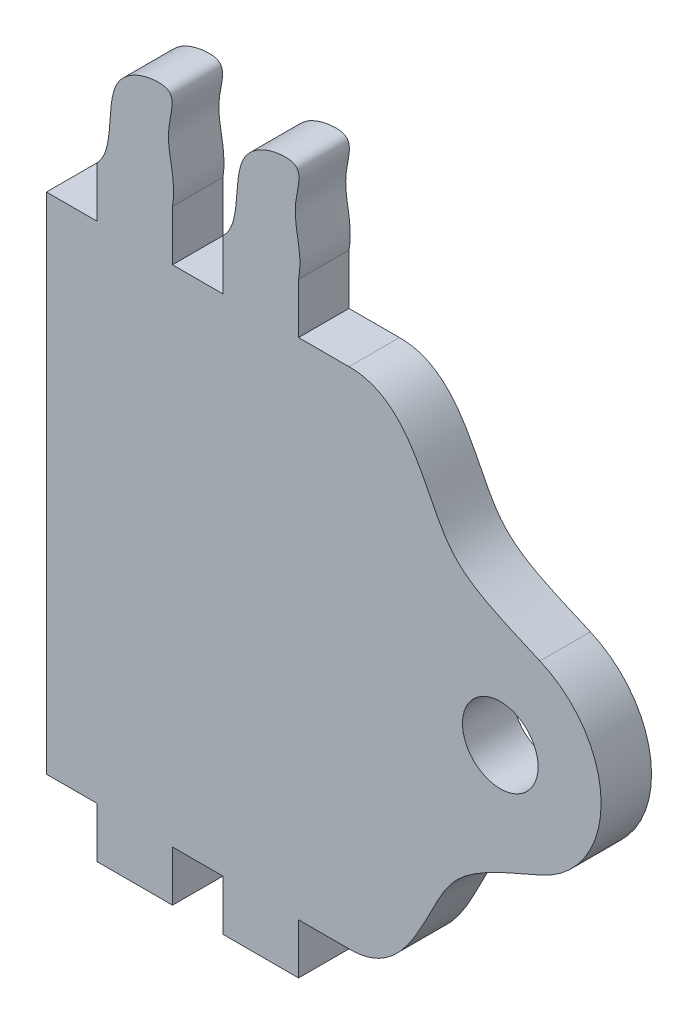
ISO-10303-21;
HEADER;
FILE_DESCRIPTION(('STEP AP214'),'2;1');
FILE_NAME('part.step','',(''),(''),'','','');
FILE_SCHEMA(('AUTOMOTIVE_DESIGN { 1 0 10303 214 1 1 1 1 }'));
ENDSEC;
DATA;
#1=APPLICATION_CONTEXT('core data for automotive mechanical design processes');
#2=APPLICATION_PROTOCOL_DEFINITION('international standard','automotive_design',2000,#1);
#3=PRODUCT_CONTEXT('',#1,'mechanical');
#4=PRODUCT('Part','Part','',(#3));
#5=PRODUCT_RELATED_PRODUCT_CATEGORY('part','',(#4));
#6=PRODUCT_DEFINITION_FORMATION('','',#4);
#7=PRODUCT_DEFINITION_CONTEXT('part definition',#1,'design');
#8=PRODUCT_DEFINITION('design','',#6,#7);
#9=PRODUCT_DEFINITION_SHAPE('','',#8);
#10=(LENGTH_UNIT() NAMED_UNIT(*) SI_UNIT(.MILLI.,.METRE.));
#11=(NAMED_UNIT(*) PLANE_ANGLE_UNIT() SI_UNIT($,.RADIAN.));
#12=(NAMED_UNIT(*) SI_UNIT($,.STERADIAN.) SOLID_ANGLE_UNIT());
#13=UNCERTAINTY_MEASURE_WITH_UNIT(LENGTH_MEASURE(1.E-05),#10,'distance_accuracy_value','');
#14=(GEOMETRIC_REPRESENTATION_CONTEXT(3) GLOBAL_UNCERTAINTY_ASSIGNED_CONTEXT((#13)) GLOBAL_UNIT_ASSIGNED_CONTEXT((#10,
#11,#12)) REPRESENTATION_CONTEXT('',''));
#15=CARTESIAN_POINT('',(0.,0.,0.));
#16=DIRECTION('',(0.,0.,1.));
#17=DIRECTION('',(1.,0.,0.));
#18=AXIS2_PLACEMENT_3D('',#15,#16,#17);
#19=CARTESIAN_POINT('',(1.5875,19.05,3.175));
#20=CARTESIAN_POINT('',(2.87606069652057,20.2829772560216,3.175));
#21=CARTESIAN_POINT('',(1.75087616831117,23.7170103339782,3.175));
#22=CARTESIAN_POINT('',(4.48010535425709,25.3439433085735,3.175));
#23=CARTESIAN_POINT('',(6.71396979884259,25.323271855298,3.175));
#24=CARTESIAN_POINT('',(5.66462971551239,22.0755663258377,3.175));
#25=CARTESIAN_POINT('',(6.66156491028358,20.8587639296577,3.175));
#26=CARTESIAN_POINT('',(6.35,19.05,3.175));
#27=B_SPLINE_CURVE_WITH_KNOTS('',3,(#19,#20,#21,#22,#23,#24,#25,#26),.UNSPECIFIED.,.F.,.F.,(4,1,
1,1,1,4),(0.,0.347503901702422,0.512635707363676,0.589513020634842,0.712232461777551,1.),.UNSPECIFIED.);
#28=DIRECTION('',(0.,0.,-1.));
#29=VECTOR('',#28,1.);
#30=SURFACE_OF_LINEAR_EXTRUSION('',#27,#29);
#31=CARTESIAN_POINT('',(1.5875,19.05,0.));
#32=CARTESIAN_POINT('',(2.87606069652057,20.2829772560216,0.));
#33=CARTESIAN_POINT('',(1.75087616831117,23.7170103339782,0.));
#34=CARTESIAN_POINT('',(4.48010535425709,25.3439433085735,0.));
#35=CARTESIAN_POINT('',(6.71396979884259,25.323271855298,0.));
#36=CARTESIAN_POINT('',(5.66462971551239,22.0755663258377,0.));
#37=CARTESIAN_POINT('',(6.66156491028358,20.8587639296577,0.));
#38=CARTESIAN_POINT('',(6.35,19.05,0.));
#39=B_SPLINE_CURVE_WITH_KNOTS('',3,(#31,#32,#33,#34,#35,#36,#37,#38),.UNSPECIFIED.,.F.,.F.,(4,1,
1,1,1,4),(0.,0.347503901702422,0.512635707363676,0.589513020634842,0.712232461777551,1.),.UNSPECIFIED.);
#40=CARTESIAN_POINT('',(1.5875,19.05,0.));
#41=VERTEX_POINT('',#40);
#42=CARTESIAN_POINT('',(6.35,19.05,0.));
#43=VERTEX_POINT('',#42);
#44=EDGE_CURVE('E355',#41,#43,#39,.T.);
#45=ORIENTED_EDGE('',*,*,#44,.F.);
#46=DIRECTION('',(0.,0.,-1.));
#47=VECTOR('',#46,1.);
#48=CARTESIAN_POINT('',(1.5875,19.05,3.175));
#49=LINE('',#48,#47);
#50=CARTESIAN_POINT('',(1.5875,19.05,3.175));
#51=VERTEX_POINT('',#50);
#52=EDGE_CURVE('E12',#51,#41,#49,.T.);
#53=ORIENTED_EDGE('',*,*,#52,.F.);
#54=CARTESIAN_POINT('',(6.35,19.05,3.175));
#55=VERTEX_POINT('',#54);
#56=EDGE_CURVE('E363',#51,#55,#27,.T.);
#57=ORIENTED_EDGE('',*,*,#56,.T.);
#58=DIRECTION('',(0.,0.,-1.));
#59=VECTOR('',#58,1.);
#60=CARTESIAN_POINT('',(6.35,19.05,3.175));
#61=LINE('',#60,#59);
#62=EDGE_CURVE('E206',#55,#43,#61,.T.);
#63=ORIENTED_EDGE('',*,*,#62,.T.);
#64=EDGE_LOOP('',(#45,#53,#57,#63));
#65=FACE_BOUND('',#64,.T.);
#66=ADVANCED_FACE('F196',(#65),#30,.T.);
#67=CARTESIAN_POINT('',(0.,0.,3.175));
#68=DIRECTION('',(0.,0.,1.));
#69=DIRECTION('',(1.,0.,0.));
#70=AXIS2_PLACEMENT_3D('',#67,#68,#69);
#71=PLANE('',#70);
#72=ORIENTED_EDGE('',*,*,#56,.F.);
#73=DIRECTION('',(0.,1.,0.));
#74=VECTOR('',#73,1.);
#75=CARTESIAN_POINT('',(1.5875,15.875,3.175));
#76=LINE('',#75,#74);
#77=CARTESIAN_POINT('',(1.5875,15.875,3.175));
#78=VERTEX_POINT('',#77);
#79=EDGE_CURVE('E349',#78,#51,#76,.T.);
#80=ORIENTED_EDGE('',*,*,#79,.F.);
#81=DIRECTION('',(-1.,0.,0.));
#82=VECTOR('',#81,1.);
#83=CARTESIAN_POINT('',(0.,15.875,3.175));
#84=LINE('',#83,#82);
#85=CARTESIAN_POINT('',(-1.5875,15.875,3.175));
#86=VERTEX_POINT('',#85);
#87=EDGE_CURVE('E360',#78,#86,#84,.T.);
#88=ORIENTED_EDGE('',*,*,#87,.T.);
#89=DIRECTION('',(0.,1.,0.));
#90=VECTOR('',#89,1.);
#91=CARTESIAN_POINT('',(-1.5875,0.,3.175));
#92=LINE('',#91,#90);
#93=CARTESIAN_POINT('',(-1.5875,19.05,3.175));
#94=VERTEX_POINT('',#93);
#95=EDGE_CURVE('E376',#86,#94,#92,.T.);
#96=ORIENTED_EDGE('',*,*,#95,.T.);
#97=CARTESIAN_POINT('',(-6.35,19.05,3.175));
#98=CARTESIAN_POINT('',(-5.10894803273728,20.3128381420379,3.175));
#99=CARTESIAN_POINT('',(-6.2487975668104,23.7826275370671,3.175));
#100=CARTESIAN_POINT('',(-3.5046682451137,25.4227491748254,3.175));
#101=CARTESIAN_POINT('',(-1.27059543399362,25.4018504855543,3.175));
#102=CARTESIAN_POINT('',(-2.33046195009797,22.1181936868102,3.175));
#103=CARTESIAN_POINT('',(-1.30296019047837,20.9022932957206,3.175));
#104=CARTESIAN_POINT('',(-1.5875,19.05,3.175));
#105=B_SPLINE_CURVE_WITH_KNOTS('',3,(#97,#98,#99,#100,#101,#102,#103,#104),.UNSPECIFIED.,.F.,
.F.,(4,1,1,1,1,4),(0.,0.348300856335532,0.511853830627675,0.587996117031789,0.709542233008579,
1.),.UNSPECIFIED.);
#106=CARTESIAN_POINT('',(-6.35,19.05,3.175));
#107=VERTEX_POINT('',#106);
#108=EDGE_CURVE('E390',#107,#94,#105,.T.);
#109=ORIENTED_EDGE('',*,*,#108,.F.);
#110=DIRECTION('',(0.,1.,0.));
#111=VECTOR('',#110,1.);
#112=CARTESIAN_POINT('',(-6.35,0.,3.175));
#113=LINE('',#112,#111);
#114=CARTESIAN_POINT('',(-6.35,15.875,3.175));
#115=VERTEX_POINT('',#114);
#116=EDGE_CURVE('E381',#115,#107,#113,.T.);
#117=ORIENTED_EDGE('',*,*,#116,.F.);
#118=CARTESIAN_POINT('',(-9.525,15.875,3.175));
#119=VERTEX_POINT('',#118);
#120=EDGE_CURVE('E374',#115,#119,#84,.T.);
#121=ORIENTED_EDGE('',*,*,#120,.T.);
#122=DIRECTION('',(0.,1.,0.));
#123=VECTOR('',#122,1.);
#124=CARTESIAN_POINT('',(-9.525,0.,3.175));
#125=LINE('',#124,#123);
#126=CARTESIAN_POINT('',(-9.525,-15.875,3.175));
#127=VERTEX_POINT('',#126);
#128=EDGE_CURVE('E461',#127,#119,#125,.T.);
#129=ORIENTED_EDGE('',*,*,#128,.F.);
#130=DIRECTION('',(-1.,0.,0.));
#131=VECTOR('',#130,1.);
#132=CARTESIAN_POINT('',(0.,-15.875,3.175));
#133=LINE('',#132,#131);
#134=CARTESIAN_POINT('',(-6.34999999999999,-15.875,3.175));
#135=VERTEX_POINT('',#134);
#136=EDGE_CURVE('E523',#135,#127,#133,.T.);
#137=ORIENTED_EDGE('',*,*,#136,.F.);
#138=DIRECTION('',(0.,-1.,0.));
#139=VECTOR('',#138,1.);
#140=CARTESIAN_POINT('',(-6.35,0.,3.175));
#141=LINE('',#140,#139);
#142=CARTESIAN_POINT('',(-6.34999999999999,-19.05,3.175));
#143=VERTEX_POINT('',#142);
#144=EDGE_CURVE('E526',#135,#143,#141,.T.);
#145=ORIENTED_EDGE('',*,*,#144,.T.);
#146=DIRECTION('',(1.,0.,0.));
#147=VECTOR('',#146,1.);
#148=CARTESIAN_POINT('',(0.,-19.05,3.175));
#149=LINE('',#148,#147);
#150=CARTESIAN_POINT('',(-1.58749999999999,-19.05,3.175));
#151=VERTEX_POINT('',#150);
#152=EDGE_CURVE('E530',#143,#151,#149,.T.);
#153=ORIENTED_EDGE('',*,*,#152,.T.);
#154=DIRECTION('',(0.,-1.,0.));
#155=VECTOR('',#154,1.);
#156=CARTESIAN_POINT('',(-1.5875,0.,3.175));
#157=LINE('',#156,#155);
#158=CARTESIAN_POINT('',(-1.58749999999999,-15.875,3.175));
#159=VERTEX_POINT('',#158);
#160=EDGE_CURVE('E532',#159,#151,#157,.T.);
#161=ORIENTED_EDGE('',*,*,#160,.F.);
#162=CARTESIAN_POINT('',(1.58750000000001,-15.875,3.175));
#163=VERTEX_POINT('',#162);
#164=EDGE_CURVE('E528',#163,#159,#133,.T.);
#165=ORIENTED_EDGE('',*,*,#164,.F.);
#166=DIRECTION('',(0.,-1.,0.));
#167=VECTOR('',#166,1.);
#168=CARTESIAN_POINT('',(1.5875,0.,3.175));
#169=LINE('',#168,#167);
#170=CARTESIAN_POINT('',(1.58750000000001,-19.05,3.175));
#171=VERTEX_POINT('',#170);
#172=EDGE_CURVE('E535',#163,#171,#169,.T.);
#173=ORIENTED_EDGE('',*,*,#172,.T.);
#174=DIRECTION('',(1.,0.,0.));
#175=VECTOR('',#174,1.);
#176=CARTESIAN_POINT('',(0.,-19.05,3.175));
#177=LINE('',#176,#175);
#178=CARTESIAN_POINT('',(6.35000000000001,-19.05,3.175));
#179=VERTEX_POINT('',#178);
#180=EDGE_CURVE('E537',#171,#179,#177,.T.);
#181=ORIENTED_EDGE('',*,*,#180,.T.);
#182=DIRECTION('',(0.,-1.,0.));
#183=VECTOR('',#182,1.);
#184=CARTESIAN_POINT('',(6.35,0.,3.175));
#185=LINE('',#184,#183);
#186=CARTESIAN_POINT('',(6.35000000000001,-15.875,3.175));
#187=VERTEX_POINT('',#186);
#188=EDGE_CURVE('E539',#187,#179,#185,.T.);
#189=ORIENTED_EDGE('',*,*,#188,.F.);
#190=CARTESIAN_POINT('',(9.525,-15.875,3.175));
#191=VERTEX_POINT('',#190);
#192=EDGE_CURVE('E527',#191,#187,#133,.T.);
#193=ORIENTED_EDGE('',*,*,#192,.F.);
#194=CARTESIAN_POINT('',(21.5475943035882,-5.83819515729678,3.175));
#195=CARTESIAN_POINT('',(17.7413983110655,-7.46649520091281,3.175));
#196=CARTESIAN_POINT('',(15.0309393036737,-8.83650062794347,3.175));
#197=CARTESIAN_POINT('',(13.0092812161382,-15.9170915840705,3.175));
#198=CARTESIAN_POINT('',(9.525,-15.875,3.175));
#199=B_SPLINE_CURVE_WITH_KNOTS('',3,(#194,#195,#196,#197,#198),.UNSPECIFIED.,.F.,.F.,(4,1,4),
(0.,0.458191309021658,1.),.UNSPECIFIED.);
#200=CARTESIAN_POINT('',(21.5475943035882,-5.83819515729678,3.175));
#201=VERTEX_POINT('',#200);
#202=EDGE_CURVE('E542',#201,#191,#199,.T.);
#203=ORIENTED_EDGE('',*,*,#202,.F.);
#204=CARTESIAN_POINT('',(19.05,0.,3.175));
#205=DIRECTION('',(0.,0.,1.));
#206=DIRECTION('',(1.,0.,0.));
#207=AXIS2_PLACEMENT_3D('',#204,#205,#206);
#208=CIRCLE('',#207,6.35);
#209=CARTESIAN_POINT('',(21.5475943035882,5.83819515729678,3.175));
#210=VERTEX_POINT('',#209);
#211=EDGE_CURVE('E377',#210,#201,#208,.F.);
#212=ORIENTED_EDGE('',*,*,#211,.F.);
#213=CARTESIAN_POINT('',(21.5475943035882,5.83819515729678,3.175));
#214=CARTESIAN_POINT('',(17.7413983110655,7.46649520091281,3.175));
#215=CARTESIAN_POINT('',(15.0309393036737,8.83650062794347,3.175));
#216=CARTESIAN_POINT('',(13.0092812161382,15.9170915840705,3.175));
#217=CARTESIAN_POINT('',(9.525,15.875,3.175));
#218=B_SPLINE_CURVE_WITH_KNOTS('',3,(#213,#214,#215,#216,#217),.UNSPECIFIED.,.F.,.F.,(4,1,4),
(0.,0.458191309021658,1.),.UNSPECIFIED.);
#219=CARTESIAN_POINT('',(9.525,15.875,3.175));
#220=VERTEX_POINT('',#219);
#221=EDGE_CURVE('E372',#210,#220,#218,.T.);
#222=ORIENTED_EDGE('',*,*,#221,.T.);
#223=CARTESIAN_POINT('',(6.35,15.875,3.175));
#224=VERTEX_POINT('',#223);
#225=EDGE_CURVE('E371',#220,#224,#84,.T.);
#226=ORIENTED_EDGE('',*,*,#225,.T.);
#227=DIRECTION('',(0.,1.,0.));
#228=VECTOR('',#227,1.);
#229=CARTESIAN_POINT('',(6.35,15.875,3.175));
#230=LINE('',#229,#228);
#231=EDGE_CURVE('E365',#224,#55,#230,.T.);
#232=ORIENTED_EDGE('',*,*,#231,.T.);
#233=EDGE_LOOP('',(#72,#80,#88,#96,#109,#117,#121,#129,#137,#145,#153,#161,#165,#173,#181,#189,
#193,#203,#212,#222,#226,#232));
#234=FACE_BOUND('',#233,.T.);
#235=CARTESIAN_POINT('',(19.05,0.,3.175));
#236=DIRECTION('',(0.,0.,1.));
#237=DIRECTION('',(1.,0.,0.));
#238=AXIS2_PLACEMENT_3D('',#235,#236,#237);
#239=CIRCLE('',#238,2.38125);
#240=CARTESIAN_POINT('',(21.43125,0.,3.175));
#241=VERTEX_POINT('',#240);
#242=EDGE_CURVE('E380',#241,#241,#239,.F.);
#243=ORIENTED_EDGE('',*,*,#242,.T.);
#244=EDGE_LOOP('',(#243));
#245=FACE_BOUND('',#244,.T.);
#246=ADVANCED_FACE('F358',(#234,#245),#71,.T.);
#247=CARTESIAN_POINT('',(0.,0.,0.));
#248=DIRECTION('',(0.,0.,1.));
#249=DIRECTION('',(1.,0.,0.));
#250=AXIS2_PLACEMENT_3D('',#247,#248,#249);
#251=PLANE('',#250);
#252=ORIENTED_EDGE('',*,*,#44,.T.);
#253=DIRECTION('',(0.,1.,0.));
#254=VECTOR('',#253,1.);
#255=CARTESIAN_POINT('',(6.35,15.875,0.));
#256=LINE('',#255,#254);
#257=CARTESIAN_POINT('',(6.35,15.875,0.));
#258=VERTEX_POINT('',#257);
#259=EDGE_CURVE('E500',#258,#43,#256,.T.);
#260=ORIENTED_EDGE('',*,*,#259,.F.);
#261=DIRECTION('',(-1.,0.,0.));
#262=VECTOR('',#261,1.);
#263=CARTESIAN_POINT('',(0.,15.875,0.));
#264=LINE('',#263,#262);
#265=CARTESIAN_POINT('',(9.525,15.875,0.));
#266=VERTEX_POINT('',#265);
#267=EDGE_CURVE('E438',#266,#258,#264,.T.);
#268=ORIENTED_EDGE('',*,*,#267,.F.);
#269=CARTESIAN_POINT('',(21.5475943035882,5.83819515729678,0.));
#270=CARTESIAN_POINT('',(17.7413983110655,7.46649520091281,0.));
#271=CARTESIAN_POINT('',(15.0309393036737,8.83650062794347,0.));
#272=CARTESIAN_POINT('',(13.0092812161382,15.9170915840705,0.));
#273=CARTESIAN_POINT('',(9.525,15.875,0.));
#274=B_SPLINE_CURVE_WITH_KNOTS('',3,(#269,#270,#271,#272,#273),.UNSPECIFIED.,.F.,.F.,(4,1,4),
(0.,0.458191309021658,1.),.UNSPECIFIED.);
#275=CARTESIAN_POINT('',(21.5475943035882,5.83819515729678,0.));
#276=VERTEX_POINT('',#275);
#277=EDGE_CURVE('E433',#276,#266,#274,.T.);
#278=ORIENTED_EDGE('',*,*,#277,.F.);
#279=CARTESIAN_POINT('',(19.05,0.,0.));
#280=DIRECTION('',(0.,0.,1.));
#281=DIRECTION('',(1.,0.,0.));
#282=AXIS2_PLACEMENT_3D('',#279,#280,#281);
#283=CIRCLE('',#282,6.35);
#284=CARTESIAN_POINT('',(21.5475943035882,-5.83819515729678,0.));
#285=VERTEX_POINT('',#284);
#286=EDGE_CURVE('E427',#276,#285,#283,.F.);
#287=ORIENTED_EDGE('',*,*,#286,.T.);
#288=CARTESIAN_POINT('',(21.5475943035882,-5.83819515729678,0.));
#289=CARTESIAN_POINT('',(17.7413983110655,-7.46649520091281,0.));
#290=CARTESIAN_POINT('',(15.0309393036737,-8.83650062794347,0.));
#291=CARTESIAN_POINT('',(13.0092812161382,-15.9170915840705,0.));
#292=CARTESIAN_POINT('',(9.525,-15.875,0.));
#293=B_SPLINE_CURVE_WITH_KNOTS('',3,(#288,#289,#290,#291,#292),.UNSPECIFIED.,.F.,.F.,(4,1,4),
(0.,0.458191309021658,1.),.UNSPECIFIED.);
#294=CARTESIAN_POINT('',(9.525,-15.875,0.));
#295=VERTEX_POINT('',#294);
#296=EDGE_CURVE('E422',#285,#295,#293,.T.);
#297=ORIENTED_EDGE('',*,*,#296,.T.);
#298=DIRECTION('',(-1.,0.,0.));
#299=VECTOR('',#298,1.);
#300=CARTESIAN_POINT('',(0.,-15.875,0.));
#301=LINE('',#300,#299);
#302=CARTESIAN_POINT('',(6.35000000000001,-15.875,0.));
#303=VERTEX_POINT('',#302);
#304=EDGE_CURVE('E405',#295,#303,#301,.T.);
#305=ORIENTED_EDGE('',*,*,#304,.T.);
#306=DIRECTION('',(0.,-1.,0.));
#307=VECTOR('',#306,1.);
#308=CARTESIAN_POINT('',(6.35,0.,0.));
#309=LINE('',#308,#307);
#310=CARTESIAN_POINT('',(6.35000000000001,-19.05,0.));
#311=VERTEX_POINT('',#310);
#312=EDGE_CURVE('E419',#303,#311,#309,.T.);
#313=ORIENTED_EDGE('',*,*,#312,.T.);
#314=DIRECTION('',(1.,0.,0.));
#315=VECTOR('',#314,1.);
#316=CARTESIAN_POINT('',(0.,-19.05,0.));
#317=LINE('',#316,#315);
#318=CARTESIAN_POINT('',(1.58750000000001,-19.05,0.));
#319=VERTEX_POINT('',#318);
#320=EDGE_CURVE('E416',#319,#311,#317,.T.);
#321=ORIENTED_EDGE('',*,*,#320,.F.);
#322=DIRECTION('',(0.,-1.,0.));
#323=VECTOR('',#322,1.);
#324=CARTESIAN_POINT('',(1.5875,0.,0.));
#325=LINE('',#324,#323);
#326=CARTESIAN_POINT('',(1.58750000000001,-15.875,0.));
#327=VERTEX_POINT('',#326);
#328=EDGE_CURVE('E414',#327,#319,#325,.T.);
#329=ORIENTED_EDGE('',*,*,#328,.F.);
#330=CARTESIAN_POINT('',(-1.58749999999999,-15.875,0.));
#331=VERTEX_POINT('',#330);
#332=EDGE_CURVE('E406',#327,#331,#301,.T.);
#333=ORIENTED_EDGE('',*,*,#332,.T.);
#334=DIRECTION('',(0.,-1.,0.));
#335=VECTOR('',#334,1.);
#336=CARTESIAN_POINT('',(-1.5875,0.,0.));
#337=LINE('',#336,#335);
#338=CARTESIAN_POINT('',(-1.58749999999999,-19.05,0.));
#339=VERTEX_POINT('',#338);
#340=EDGE_CURVE('E411',#331,#339,#337,.T.);
#341=ORIENTED_EDGE('',*,*,#340,.T.);
#342=DIRECTION('',(1.,0.,0.));
#343=VECTOR('',#342,1.);
#344=CARTESIAN_POINT('',(0.,-19.05,0.));
#345=LINE('',#344,#343);
#346=CARTESIAN_POINT('',(-6.34999999999999,-19.05,0.));
#347=VERTEX_POINT('',#346);
#348=EDGE_CURVE('E408',#347,#339,#345,.T.);
#349=ORIENTED_EDGE('',*,*,#348,.F.);
#350=DIRECTION('',(0.,-1.,0.));
#351=VECTOR('',#350,1.);
#352=CARTESIAN_POINT('',(-6.35,0.,0.));
#353=LINE('',#352,#351);
#354=CARTESIAN_POINT('',(-6.34999999999999,-15.875,0.));
#355=VERTEX_POINT('',#354);
#356=EDGE_CURVE('E404',#355,#347,#353,.T.);
#357=ORIENTED_EDGE('',*,*,#356,.F.);
#358=CARTESIAN_POINT('',(-9.525,-15.875,0.));
#359=VERTEX_POINT('',#358);
#360=EDGE_CURVE('E401',#355,#359,#301,.T.);
#361=ORIENTED_EDGE('',*,*,#360,.T.);
#362=DIRECTION('',(0.,1.,0.));
#363=VECTOR('',#362,1.);
#364=CARTESIAN_POINT('',(-9.525,0.,0.));
#365=LINE('',#364,#363);
#366=CARTESIAN_POINT('',(-9.525,15.875,0.));
#367=VERTEX_POINT('',#366);
#368=EDGE_CURVE('E364',#359,#367,#365,.T.);
#369=ORIENTED_EDGE('',*,*,#368,.T.);
#370=CARTESIAN_POINT('',(-6.35,15.875,0.));
#371=VERTEX_POINT('',#370);
#372=EDGE_CURVE('E444',#371,#367,#264,.T.);
#373=ORIENTED_EDGE('',*,*,#372,.F.);
#374=DIRECTION('',(0.,1.,0.));
#375=VECTOR('',#374,1.);
#376=CARTESIAN_POINT('',(-6.35,0.,0.));
#377=LINE('',#376,#375);
#378=CARTESIAN_POINT('',(-6.35,19.05,0.));
#379=VERTEX_POINT('',#378);
#380=EDGE_CURVE('E452',#371,#379,#377,.T.);
#381=ORIENTED_EDGE('',*,*,#380,.T.);
#382=CARTESIAN_POINT('',(-6.35,19.05,0.));
#383=CARTESIAN_POINT('',(-5.10894803273728,20.3128381420379,0.));
#384=CARTESIAN_POINT('',(-6.2487975668104,23.7826275370671,0.));
#385=CARTESIAN_POINT('',(-3.5046682451137,25.4227491748254,0.));
#386=CARTESIAN_POINT('',(-1.27059543399362,25.4018504855543,0.));
#387=CARTESIAN_POINT('',(-2.33046195009797,22.1181936868102,0.));
#388=CARTESIAN_POINT('',(-1.30296019047837,20.9022932957206,0.));
#389=CARTESIAN_POINT('',(-1.5875,19.05,0.));
#390=B_SPLINE_CURVE_WITH_KNOTS('',3,(#382,#383,#384,#385,#386,#387,#388,#389),.UNSPECIFIED.,.F.,
.F.,(4,1,1,1,1,4),(0.,0.348300856335532,0.511853830627675,0.587996117031789,0.709542233008579,
1.),.UNSPECIFIED.);
#391=CARTESIAN_POINT('',(-1.5875,19.05,0.));
#392=VERTEX_POINT('',#391);
#393=EDGE_CURVE('E447',#379,#392,#390,.T.);
#394=ORIENTED_EDGE('',*,*,#393,.T.);
#395=DIRECTION('',(0.,1.,0.));
#396=VECTOR('',#395,1.);
#397=CARTESIAN_POINT('',(-1.5875,0.,0.));
#398=LINE('',#397,#396);
#399=CARTESIAN_POINT('',(-1.5875,15.875,0.));
#400=VERTEX_POINT('',#399);
#401=EDGE_CURVE('E443',#400,#392,#398,.T.);
#402=ORIENTED_EDGE('',*,*,#401,.F.);
#403=CARTESIAN_POINT('',(1.5875,15.875,0.));
#404=VERTEX_POINT('',#403);
#405=EDGE_CURVE('E437',#404,#400,#264,.T.);
#406=ORIENTED_EDGE('',*,*,#405,.F.);
#407=DIRECTION('',(0.,1.,0.));
#408=VECTOR('',#407,1.);
#409=CARTESIAN_POINT('',(1.5875,15.875,0.));
#410=LINE('',#409,#408);
#411=EDGE_CURVE('E200',#404,#41,#410,.T.);
#412=ORIENTED_EDGE('',*,*,#411,.T.);
#413=EDGE_LOOP('',(#252,#260,#268,#278,#287,#297,#305,#313,#321,#329,#333,#341,#349,#357,#361,
#369,#373,#381,#394,#402,#406,#412));
#414=FACE_BOUND('',#413,.T.);
#415=CARTESIAN_POINT('',(19.05,0.,0.));
#416=DIRECTION('',(0.,0.,1.));
#417=DIRECTION('',(1.,0.,0.));
#418=AXIS2_PLACEMENT_3D('',#415,#416,#417);
#419=CIRCLE('',#418,2.38125);
#420=CARTESIAN_POINT('',(21.43125,0.,0.));
#421=VERTEX_POINT('',#420);
#422=EDGE_CURVE('E458',#421,#421,#419,.F.);
#423=ORIENTED_EDGE('',*,*,#422,.F.);
#424=EDGE_LOOP('',(#423));
#425=FACE_BOUND('',#424,.T.);
#426=ADVANCED_FACE('F505',(#414,#425),#251,.F.);
#427=CARTESIAN_POINT('',(19.05,0.,3.175));
#428=DIRECTION('',(0.,0.,-1.));
#429=DIRECTION('',(-1.,0.,0.));
#430=AXIS2_PLACEMENT_3D('',#427,#428,#429);
#431=CYLINDRICAL_SURFACE('',#430,2.38125);
#432=ORIENTED_EDGE('',*,*,#242,.F.);
#433=EDGE_LOOP('',(#432));
#434=FACE_BOUND('',#433,.T.);
#435=ORIENTED_EDGE('',*,*,#422,.T.);
#436=EDGE_LOOP('',(#435));
#437=FACE_BOUND('',#436,.T.);
#438=ADVANCED_FACE('F610',(#434,#437),#431,.F.);
#439=CARTESIAN_POINT('',(0.,-15.875,3.175));
#440=DIRECTION('',(0.,-1.,0.));
#441=DIRECTION('',(0.,0.,-1.));
#442=AXIS2_PLACEMENT_3D('',#439,#440,#441);
#443=PLANE('',#442);
#444=ORIENTED_EDGE('',*,*,#360,.F.);
#445=DIRECTION('',(0.,0.,-1.));
#446=VECTOR('',#445,1.);
#447=CARTESIAN_POINT('',(-6.34999999999999,-15.875,3.175));
#448=LINE('',#447,#446);
#449=EDGE_CURVE('E495',#135,#355,#448,.T.);
#450=ORIENTED_EDGE('',*,*,#449,.F.);
#451=ORIENTED_EDGE('',*,*,#136,.T.);
#452=DIRECTION('',(0.,0.,-1.));
#453=VECTOR('',#452,1.);
#454=CARTESIAN_POINT('',(-9.525,-15.875,3.175));
#455=LINE('',#454,#453);
#456=EDGE_CURVE('E497',#127,#359,#455,.T.);
#457=ORIENTED_EDGE('',*,*,#456,.T.);
#458=EDGE_LOOP('',(#444,#450,#451,#457));
#459=FACE_BOUND('',#458,.T.);
#460=ADVANCED_FACE('F564',(#459),#443,.T.);
#461=CARTESIAN_POINT('',(-6.35,0.,3.175));
#462=DIRECTION('',(1.,0.,0.));
#463=DIRECTION('',(0.,1.,0.));
#464=AXIS2_PLACEMENT_3D('',#461,#462,#463);
#465=PLANE('',#464);
#466=ORIENTED_EDGE('',*,*,#356,.T.);
#467=DIRECTION('',(0.,0.,-1.));
#468=VECTOR('',#467,1.);
#469=CARTESIAN_POINT('',(-6.34999999999999,-19.05,3.175));
#470=LINE('',#469,#468);
#471=EDGE_CURVE('E492',#143,#347,#470,.T.);
#472=ORIENTED_EDGE('',*,*,#471,.F.);
#473=ORIENTED_EDGE('',*,*,#144,.F.);
#474=ORIENTED_EDGE('',*,*,#449,.T.);
#475=EDGE_LOOP('',(#466,#472,#473,#474));
#476=FACE_BOUND('',#475,.T.);
#477=ADVANCED_FACE('F584',(#476),#465,.F.);
#478=CARTESIAN_POINT('',(0.,-19.05,3.175));
#479=DIRECTION('',(0.,1.,0.));
#480=DIRECTION('',(0.,0.,1.));
#481=AXIS2_PLACEMENT_3D('',#478,#479,#480);
#482=PLANE('',#481);
#483=ORIENTED_EDGE('',*,*,#348,.T.);
#484=DIRECTION('',(0.,0.,-1.));
#485=VECTOR('',#484,1.);
#486=CARTESIAN_POINT('',(-1.58749999999999,-19.05,3.175));
#487=LINE('',#486,#485);
#488=EDGE_CURVE('E490',#151,#339,#487,.T.);
#489=ORIENTED_EDGE('',*,*,#488,.F.);
#490=ORIENTED_EDGE('',*,*,#152,.F.);
#491=ORIENTED_EDGE('',*,*,#471,.T.);
#492=EDGE_LOOP('',(#483,#489,#490,#491));
#493=FACE_BOUND('',#492,.T.);
#494=ADVANCED_FACE('F580',(#493),#482,.F.);
#495=CARTESIAN_POINT('',(-1.5875,0.,3.175));
#496=DIRECTION('',(1.,0.,0.));
#497=DIRECTION('',(0.,1.,0.));
#498=AXIS2_PLACEMENT_3D('',#495,#496,#497);
#499=PLANE('',#498);
#500=ORIENTED_EDGE('',*,*,#340,.F.);
#501=DIRECTION('',(0.,0.,-1.));
#502=VECTOR('',#501,1.);
#503=CARTESIAN_POINT('',(-1.58749999999999,-15.875,3.175));
#504=LINE('',#503,#502);
#505=EDGE_CURVE('E488',#159,#331,#504,.T.);
#506=ORIENTED_EDGE('',*,*,#505,.F.);
#507=ORIENTED_EDGE('',*,*,#160,.T.);
#508=ORIENTED_EDGE('',*,*,#488,.T.);
#509=EDGE_LOOP('',(#500,#506,#507,#508));
#510=FACE_BOUND('',#509,.T.);
#511=ADVANCED_FACE('F577',(#510),#499,.T.);
#512=ORIENTED_EDGE('',*,*,#332,.F.);
#513=DIRECTION('',(0.,0.,-1.));
#514=VECTOR('',#513,1.);
#515=CARTESIAN_POINT('',(1.58750000000001,-15.875,3.175));
#516=LINE('',#515,#514);
#517=EDGE_CURVE('E486',#163,#327,#516,.T.);
#518=ORIENTED_EDGE('',*,*,#517,.F.);
#519=ORIENTED_EDGE('',*,*,#164,.T.);
#520=ORIENTED_EDGE('',*,*,#505,.T.);
#521=EDGE_LOOP('',(#512,#518,#519,#520));
#522=FACE_BOUND('',#521,.T.);
#523=ADVANCED_FACE('F565',(#522),#443,.T.);
#524=CARTESIAN_POINT('',(1.5875,0.,3.175));
#525=DIRECTION('',(1.,0.,0.));
#526=DIRECTION('',(0.,1.,0.));
#527=AXIS2_PLACEMENT_3D('',#524,#525,#526);
#528=PLANE('',#527);
#529=ORIENTED_EDGE('',*,*,#328,.T.);
#530=DIRECTION('',(0.,0.,-1.));
#531=VECTOR('',#530,1.);
#532=CARTESIAN_POINT('',(1.58750000000001,-19.05,3.175));
#533=LINE('',#532,#531);
#534=EDGE_CURVE('E483',#171,#319,#533,.T.);
#535=ORIENTED_EDGE('',*,*,#534,.F.);
#536=ORIENTED_EDGE('',*,*,#172,.F.);
#537=ORIENTED_EDGE('',*,*,#517,.T.);
#538=EDGE_LOOP('',(#529,#535,#536,#537));
#539=FACE_BOUND('',#538,.T.);
#540=ADVANCED_FACE('F572',(#539),#528,.F.);
#541=CARTESIAN_POINT('',(0.,-19.05,3.175));
#542=DIRECTION('',(0.,1.,0.));
#543=DIRECTION('',(0.,0.,1.));
#544=AXIS2_PLACEMENT_3D('',#541,#542,#543);
#545=PLANE('',#544);
#546=ORIENTED_EDGE('',*,*,#320,.T.);
#547=DIRECTION('',(0.,0.,-1.));
#548=VECTOR('',#547,1.);
#549=CARTESIAN_POINT('',(6.35000000000001,-19.05,3.175));
#550=LINE('',#549,#548);
#551=EDGE_CURVE('E481',#179,#311,#550,.T.);
#552=ORIENTED_EDGE('',*,*,#551,.F.);
#553=ORIENTED_EDGE('',*,*,#180,.F.);
#554=ORIENTED_EDGE('',*,*,#534,.T.);
#555=EDGE_LOOP('',(#546,#552,#553,#554));
#556=FACE_BOUND('',#555,.T.);
#557=ADVANCED_FACE('F568',(#556),#545,.F.);
#558=CARTESIAN_POINT('',(6.35,0.,3.175));
#559=DIRECTION('',(1.,0.,0.));
#560=DIRECTION('',(0.,1.,0.));
#561=AXIS2_PLACEMENT_3D('',#558,#559,#560);
#562=PLANE('',#561);
#563=ORIENTED_EDGE('',*,*,#312,.F.);
#564=DIRECTION('',(0.,0.,-1.));
#565=VECTOR('',#564,1.);
#566=CARTESIAN_POINT('',(6.35000000000001,-15.875,3.175));
#567=LINE('',#566,#565);
#568=EDGE_CURVE('E479',#187,#303,#567,.T.);
#569=ORIENTED_EDGE('',*,*,#568,.F.);
#570=ORIENTED_EDGE('',*,*,#188,.T.);
#571=ORIENTED_EDGE('',*,*,#551,.T.);
#572=EDGE_LOOP('',(#563,#569,#570,#571));
#573=FACE_BOUND('',#572,.T.);
#574=ADVANCED_FACE('F562',(#573),#562,.T.);
#575=ORIENTED_EDGE('',*,*,#304,.F.);
#576=DIRECTION('',(0.,0.,-1.));
#577=VECTOR('',#576,1.);
#578=CARTESIAN_POINT('',(9.525,-15.875,3.175));
#579=LINE('',#578,#577);
#580=EDGE_CURVE('E477',#191,#295,#579,.T.);
#581=ORIENTED_EDGE('',*,*,#580,.F.);
#582=ORIENTED_EDGE('',*,*,#192,.T.);
#583=ORIENTED_EDGE('',*,*,#568,.T.);
#584=EDGE_LOOP('',(#575,#581,#582,#583));
#585=FACE_BOUND('',#584,.T.);
#586=ADVANCED_FACE('F557',(#585),#443,.T.);
#587=DIRECTION('',(0.,0.,-1.));
#588=VECTOR('',#587,1.);
#589=SURFACE_OF_LINEAR_EXTRUSION('',#199,#588);
#590=ORIENTED_EDGE('',*,*,#296,.F.);
#591=DIRECTION('',(0.,0.,-1.));
#592=VECTOR('',#591,1.);
#593=CARTESIAN_POINT('',(21.5475943035882,-5.83819515729678,3.175));
#594=LINE('',#593,#592);
#595=EDGE_CURVE('E475',#201,#285,#594,.T.);
#596=ORIENTED_EDGE('',*,*,#595,.F.);
#597=ORIENTED_EDGE('',*,*,#202,.T.);
#598=ORIENTED_EDGE('',*,*,#580,.T.);
#599=EDGE_LOOP('',(#590,#596,#597,#598));
#600=FACE_BOUND('',#599,.T.);
#601=ADVANCED_FACE('F552',(#600),#589,.T.);
#602=CARTESIAN_POINT('',(19.05,0.,3.175));
#603=DIRECTION('',(0.,0.,-1.));
#604=DIRECTION('',(-1.,0.,0.));
#605=AXIS2_PLACEMENT_3D('',#602,#603,#604);
#606=CYLINDRICAL_SURFACE('',#605,6.35);
#607=ORIENTED_EDGE('',*,*,#286,.F.);
#608=DIRECTION('',(0.,0.,-1.));
#609=VECTOR('',#608,1.);
#610=CARTESIAN_POINT('',(21.5475943035882,5.83819515729678,3.175));
#611=LINE('',#610,#609);
#612=EDGE_CURVE('E473',#210,#276,#611,.T.);
#613=ORIENTED_EDGE('',*,*,#612,.F.);
#614=ORIENTED_EDGE('',*,*,#211,.T.);
#615=ORIENTED_EDGE('',*,*,#595,.T.);
#616=EDGE_LOOP('',(#607,#613,#614,#615));
#617=FACE_BOUND('',#616,.T.);
#618=ADVANCED_FACE('F556',(#617),#606,.T.);
#619=DIRECTION('',(0.,0.,-1.));
#620=VECTOR('',#619,1.);
#621=SURFACE_OF_LINEAR_EXTRUSION('',#218,#620);
#622=ORIENTED_EDGE('',*,*,#277,.T.);
#623=DIRECTION('',(0.,0.,-1.));
#624=VECTOR('',#623,1.);
#625=CARTESIAN_POINT('',(9.525,15.875,3.175));
#626=LINE('',#625,#624);
#627=EDGE_CURVE('E470',#220,#266,#626,.T.);
#628=ORIENTED_EDGE('',*,*,#627,.F.);
#629=ORIENTED_EDGE('',*,*,#221,.F.);
#630=ORIENTED_EDGE('',*,*,#612,.T.);
#631=EDGE_LOOP('',(#622,#628,#629,#630));
#632=FACE_BOUND('',#631,.T.);
#633=ADVANCED_FACE('F604',(#632),#621,.F.);
#634=CARTESIAN_POINT('',(-1.5875,0.,3.175));
#635=DIRECTION('',(-1.,0.,0.));
#636=DIRECTION('',(0.,0.,1.));
#637=AXIS2_PLACEMENT_3D('',#634,#635,#636);
#638=PLANE('',#637);
#639=ORIENTED_EDGE('',*,*,#401,.T.);
#640=DIRECTION('',(0.,0.,-1.));
#641=VECTOR('',#640,1.);
#642=CARTESIAN_POINT('',(-1.5875,19.05,3.175));
#643=LINE('',#642,#641);
#644=EDGE_CURVE('E467',#94,#392,#643,.T.);
#645=ORIENTED_EDGE('',*,*,#644,.F.);
#646=ORIENTED_EDGE('',*,*,#95,.F.);
#647=DIRECTION('',(0.,0.,-1.));
#648=VECTOR('',#647,1.);
#649=CARTESIAN_POINT('',(-1.5875,15.875,3.175));
#650=LINE('',#649,#648);
#651=EDGE_CURVE('E369',#86,#400,#650,.T.);
#652=ORIENTED_EDGE('',*,*,#651,.T.);
#653=EDGE_LOOP('',(#639,#645,#646,#652));
#654=FACE_BOUND('',#653,.T.);
#655=ADVANCED_FACE('F603',(#654),#638,.F.);
#656=DIRECTION('',(0.,0.,-1.));
#657=VECTOR('',#656,1.);
#658=SURFACE_OF_LINEAR_EXTRUSION('',#105,#657);
#659=ORIENTED_EDGE('',*,*,#393,.F.);
#660=DIRECTION('',(0.,0.,-1.));
#661=VECTOR('',#660,1.);
#662=CARTESIAN_POINT('',(-6.35,19.05,3.175));
#663=LINE('',#662,#661);
#664=EDGE_CURVE('E465',#107,#379,#663,.T.);
#665=ORIENTED_EDGE('',*,*,#664,.F.);
#666=ORIENTED_EDGE('',*,*,#108,.T.);
#667=ORIENTED_EDGE('',*,*,#644,.T.);
#668=EDGE_LOOP('',(#659,#665,#666,#667));
#669=FACE_BOUND('',#668,.T.);
#670=ADVANCED_FACE('F614',(#669),#658,.T.);
#671=CARTESIAN_POINT('',(-6.35,0.,3.175));
#672=DIRECTION('',(-1.,0.,0.));
#673=DIRECTION('',(0.,0.,1.));
#674=AXIS2_PLACEMENT_3D('',#671,#672,#673);
#675=PLANE('',#674);
#676=ORIENTED_EDGE('',*,*,#380,.F.);
#677=DIRECTION('',(0.,0.,-1.));
#678=VECTOR('',#677,1.);
#679=CARTESIAN_POINT('',(-6.35,15.875,3.175));
#680=LINE('',#679,#678);
#681=EDGE_CURVE('E463',#115,#371,#680,.T.);
#682=ORIENTED_EDGE('',*,*,#681,.F.);
#683=ORIENTED_EDGE('',*,*,#116,.T.);
#684=ORIENTED_EDGE('',*,*,#664,.T.);
#685=EDGE_LOOP('',(#676,#682,#683,#684));
#686=FACE_BOUND('',#685,.T.);
#687=ADVANCED_FACE('F608',(#686),#675,.T.);
#688=CARTESIAN_POINT('',(0.,15.875,3.175));
#689=DIRECTION('',(0.,-1.,0.));
#690=DIRECTION('',(0.,0.,-1.));
#691=AXIS2_PLACEMENT_3D('',#688,#689,#690);
#692=PLANE('',#691);
#693=ORIENTED_EDGE('',*,*,#372,.T.);
#694=DIRECTION('',(0.,0.,-1.));
#695=VECTOR('',#694,1.);
#696=CARTESIAN_POINT('',(-9.525,15.875,3.175));
#697=LINE('',#696,#695);
#698=EDGE_CURVE('E387',#119,#367,#697,.T.);
#699=ORIENTED_EDGE('',*,*,#698,.F.);
#700=ORIENTED_EDGE('',*,*,#120,.F.);
#701=ORIENTED_EDGE('',*,*,#681,.T.);
#702=EDGE_LOOP('',(#693,#699,#700,#701));
#703=FACE_BOUND('',#702,.T.);
#704=ADVANCED_FACE('F591',(#703),#692,.F.);
#705=CARTESIAN_POINT('',(-9.525,0.,3.175));
#706=DIRECTION('',(-1.,0.,0.));
#707=DIRECTION('',(0.,-1.,0.));
#708=AXIS2_PLACEMENT_3D('',#705,#706,#707);
#709=PLANE('',#708);
#710=ORIENTED_EDGE('',*,*,#368,.F.);
#711=ORIENTED_EDGE('',*,*,#456,.F.);
#712=ORIENTED_EDGE('',*,*,#128,.T.);
#713=ORIENTED_EDGE('',*,*,#698,.T.);
#714=EDGE_LOOP('',(#710,#711,#712,#713));
#715=FACE_BOUND('',#714,.T.);
#716=ADVANCED_FACE('F589',(#715),#709,.T.);
#717=ORIENTED_EDGE('',*,*,#87,.F.);
#718=DIRECTION('',(0.,0.,-1.));
#719=VECTOR('',#718,1.);
#720=CARTESIAN_POINT('',(1.5875,15.875,3.175));
#721=LINE('',#720,#719);
#722=EDGE_CURVE('E346',#78,#404,#721,.T.);
#723=ORIENTED_EDGE('',*,*,#722,.T.);
#724=ORIENTED_EDGE('',*,*,#405,.T.);
#725=ORIENTED_EDGE('',*,*,#651,.F.);
#726=EDGE_LOOP('',(#717,#723,#724,#725));
#727=FACE_BOUND('',#726,.T.);
#728=ADVANCED_FACE('F367',(#727),#692,.F.);
#729=DIRECTION('',(0.,0.,-1.));
#730=VECTOR('',#729,1.);
#731=CARTESIAN_POINT('',(6.35,15.875,3.175));
#732=LINE('',#731,#730);
#733=EDGE_CURVE('E341',#224,#258,#732,.T.);
#734=ORIENTED_EDGE('',*,*,#733,.F.);
#735=ORIENTED_EDGE('',*,*,#225,.F.);
#736=ORIENTED_EDGE('',*,*,#627,.T.);
#737=ORIENTED_EDGE('',*,*,#267,.T.);
#738=EDGE_LOOP('',(#734,#735,#736,#737));
#739=FACE_BOUND('',#738,.T.);
#740=ADVANCED_FACE('F593',(#739),#692,.F.);
#741=CARTESIAN_POINT('',(1.5875,15.875,3.175));
#742=DIRECTION('',(-1.,0.,0.));
#743=DIRECTION('',(0.,-1.,0.));
#744=AXIS2_PLACEMENT_3D('',#741,#742,#743);
#745=PLANE('',#744);
#746=ORIENTED_EDGE('',*,*,#411,.F.);
#747=ORIENTED_EDGE('',*,*,#722,.F.);
#748=ORIENTED_EDGE('',*,*,#79,.T.);
#749=ORIENTED_EDGE('',*,*,#52,.T.);
#750=EDGE_LOOP('',(#746,#747,#748,#749));
#751=FACE_BOUND('',#750,.T.);
#752=ADVANCED_FACE('F348',(#751),#745,.T.);
#753=CARTESIAN_POINT('',(6.35,15.875,3.175));
#754=DIRECTION('',(-1.,0.,0.));
#755=DIRECTION('',(0.,0.,1.));
#756=AXIS2_PLACEMENT_3D('',#753,#754,#755);
#757=PLANE('',#756);
#758=ORIENTED_EDGE('',*,*,#259,.T.);
#759=ORIENTED_EDGE('',*,*,#62,.F.);
#760=ORIENTED_EDGE('',*,*,#231,.F.);
#761=ORIENTED_EDGE('',*,*,#733,.T.);
#762=EDGE_LOOP('',(#758,#759,#760,#761));
#763=FACE_BOUND('',#762,.T.);
#764=ADVANCED_FACE('F198',(#763),#757,.F.);
#765=CLOSED_SHELL('',(#66,#246,#426,#438,#460,#477,#494,#511,#523,#540,#557,#574,#586,#601,#618,
#633,#655,#670,#687,#704,#716,#728,#740,#752,#764));
#766=MANIFOLD_SOLID_BREP('B2',#765);
#767=ADVANCED_BREP_SHAPE_REPRESENTATION('',(#18,#766),#14);
#768=SHAPE_DEFINITION_REPRESENTATION(#9,#767);
ENDSEC;
END-ISO-10303-21;
